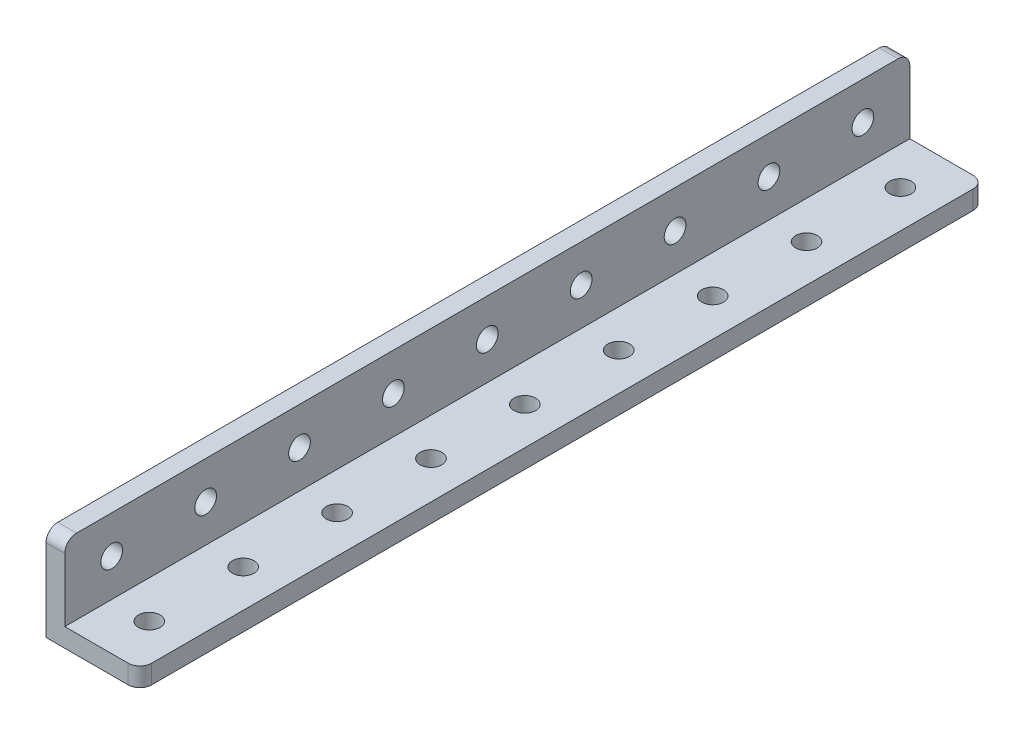
ISO-10303-21;
HEADER;
FILE_DESCRIPTION(('STEP AP214'),'2;1');
FILE_NAME('part.step','',(''),(''),'','','');
FILE_SCHEMA(('AUTOMOTIVE_DESIGN { 1 0 10303 214 1 1 1 1 }'));
ENDSEC;
DATA;
#1=APPLICATION_CONTEXT('core data for automotive mechanical design processes');
#2=APPLICATION_PROTOCOL_DEFINITION('international standard','automotive_design',2000,#1);
#3=PRODUCT_CONTEXT('',#1,'mechanical');
#4=PRODUCT('Part','Part','',(#3));
#5=PRODUCT_RELATED_PRODUCT_CATEGORY('part','',(#4));
#6=PRODUCT_DEFINITION_FORMATION('','',#4);
#7=PRODUCT_DEFINITION_CONTEXT('part definition',#1,'design');
#8=PRODUCT_DEFINITION('design','',#6,#7);
#9=PRODUCT_DEFINITION_SHAPE('','',#8);
#10=(LENGTH_UNIT() NAMED_UNIT(*) SI_UNIT(.MILLI.,.METRE.));
#11=(NAMED_UNIT(*) PLANE_ANGLE_UNIT() SI_UNIT($,.RADIAN.));
#12=(NAMED_UNIT(*) SI_UNIT($,.STERADIAN.) SOLID_ANGLE_UNIT());
#13=UNCERTAINTY_MEASURE_WITH_UNIT(LENGTH_MEASURE(1.E-05),#10,'distance_accuracy_value','');
#14=(GEOMETRIC_REPRESENTATION_CONTEXT(3) GLOBAL_UNCERTAINTY_ASSIGNED_CONTEXT((#13)) GLOBAL_UNIT_ASSIGNED_CONTEXT((#10,
#11,#12)) REPRESENTATION_CONTEXT('',''));
#15=CARTESIAN_POINT('',(0.,0.,0.));
#16=DIRECTION('',(0.,0.,1.));
#17=DIRECTION('',(1.,0.,0.));
#18=AXIS2_PLACEMENT_3D('',#15,#16,#17);
#19=CARTESIAN_POINT('',(0.,16.,0.));
#20=DIRECTION('',(0.,0.,1.));
#21=DIRECTION('',(1.,0.,0.));
#22=AXIS2_PLACEMENT_3D('',#19,#20,#21);
#23=PLANE('',#22);
#24=DIRECTION('',(0.,-1.,0.));
#25=VECTOR('',#24,1.);
#26=CARTESIAN_POINT('',(3.2,16.,0.));
#27=LINE('',#26,#25);
#28=CARTESIAN_POINT('',(3.2,14.,0.));
#29=VERTEX_POINT('',#28);
#30=CARTESIAN_POINT('',(3.2,3.2,0.));
#31=VERTEX_POINT('',#30);
#32=EDGE_CURVE('E127',#29,#31,#27,.T.);
#33=ORIENTED_EDGE('',*,*,#32,.F.);
#34=DIRECTION('',(1.,0.,0.));
#35=VECTOR('',#34,1.);
#36=CARTESIAN_POINT('',(0.,14.,0.));
#37=LINE('',#36,#35);
#38=CARTESIAN_POINT('',(0.,14.,0.));
#39=VERTEX_POINT('',#38);
#40=EDGE_CURVE('E190',#29,#39,#37,.F.);
#41=ORIENTED_EDGE('',*,*,#40,.T.);
#42=DIRECTION('',(0.,-1.,0.));
#43=VECTOR('',#42,1.);
#44=CARTESIAN_POINT('',(0.,16.,0.));
#45=LINE('',#44,#43);
#46=CARTESIAN_POINT('',(0.,0.,0.));
#47=VERTEX_POINT('',#46);
#48=EDGE_CURVE('E148',#39,#47,#45,.T.);
#49=ORIENTED_EDGE('',*,*,#48,.T.);
#50=DIRECTION('',(1.,0.,0.));
#51=VECTOR('',#50,1.);
#52=CARTESIAN_POINT('',(0.,0.,0.));
#53=LINE('',#52,#51);
#54=CARTESIAN_POINT('',(14.,0.,0.));
#55=VERTEX_POINT('',#54);
#56=EDGE_CURVE('E158',#47,#55,#53,.T.);
#57=ORIENTED_EDGE('',*,*,#56,.T.);
#58=DIRECTION('',(0.,-1.,0.));
#59=VECTOR('',#58,1.);
#60=CARTESIAN_POINT('',(14.,16.,0.));
#61=LINE('',#60,#59);
#62=CARTESIAN_POINT('',(14.,3.2,0.));
#63=VERTEX_POINT('',#62);
#64=EDGE_CURVE('E188',#55,#63,#61,.F.);
#65=ORIENTED_EDGE('',*,*,#64,.T.);
#66=DIRECTION('',(1.,0.,0.));
#67=VECTOR('',#66,1.);
#68=CARTESIAN_POINT('',(3.2,3.2,0.));
#69=LINE('',#68,#67);
#70=EDGE_CURVE('E121',#31,#63,#69,.T.);
#71=ORIENTED_EDGE('',*,*,#70,.F.);
#72=EDGE_LOOP('',(#33,#41,#49,#57,#65,#71));
#73=FACE_BOUND('',#72,.T.);
#74=ADVANCED_FACE('F33',(#73),#23,.T.);
#75=CARTESIAN_POINT('',(0.,16.,-144.));
#76=DIRECTION('',(0.,1.,0.));
#77=DIRECTION('',(0.,0.,1.));
#78=AXIS2_PLACEMENT_3D('',#75,#76,#77);
#79=PLANE('',#78);
#80=DIRECTION('',(0.,0.,1.));
#81=VECTOR('',#80,1.);
#82=CARTESIAN_POINT('',(3.2,16.,-144.));
#83=LINE('',#82,#81);
#84=CARTESIAN_POINT('',(3.2,16.,-142.));
#85=VERTEX_POINT('',#84);
#86=CARTESIAN_POINT('',(3.2,16.,-2.));
#87=VERTEX_POINT('',#86);
#88=EDGE_CURVE('E142',#85,#87,#83,.T.);
#89=ORIENTED_EDGE('',*,*,#88,.F.);
#90=DIRECTION('',(1.,0.,0.));
#91=VECTOR('',#90,1.);
#92=CARTESIAN_POINT('',(0.,16.,-142.));
#93=LINE('',#92,#91);
#94=CARTESIAN_POINT('',(0.,16.,-142.));
#95=VERTEX_POINT('',#94);
#96=EDGE_CURVE('E182',#85,#95,#93,.F.);
#97=ORIENTED_EDGE('',*,*,#96,.T.);
#98=DIRECTION('',(0.,0.,1.));
#99=VECTOR('',#98,1.);
#100=CARTESIAN_POINT('',(0.,16.,-144.));
#101=LINE('',#100,#99);
#102=CARTESIAN_POINT('',(0.,16.,-2.));
#103=VERTEX_POINT('',#102);
#104=EDGE_CURVE('E155',#95,#103,#101,.T.);
#105=ORIENTED_EDGE('',*,*,#104,.T.);
#106=DIRECTION('',(1.,0.,0.));
#107=VECTOR('',#106,1.);
#108=CARTESIAN_POINT('',(0.,16.,-2.));
#109=LINE('',#108,#107);
#110=EDGE_CURVE('E179',#103,#87,#109,.T.);
#111=ORIENTED_EDGE('',*,*,#110,.T.);
#112=EDGE_LOOP('',(#89,#97,#105,#111));
#113=FACE_BOUND('',#112,.T.);
#114=ADVANCED_FACE('F221',(#113),#79,.T.);
#115=CARTESIAN_POINT('',(0.,0.,-144.));
#116=DIRECTION('',(0.,0.,-1.));
#117=DIRECTION('',(-1.,0.,0.));
#118=AXIS2_PLACEMENT_3D('',#115,#116,#117);
#119=PLANE('',#118);
#120=DIRECTION('',(0.,1.,0.));
#121=VECTOR('',#120,1.);
#122=CARTESIAN_POINT('',(0.,0.,-144.));
#123=LINE('',#122,#121);
#124=CARTESIAN_POINT('',(0.,0.,-144.));
#125=VERTEX_POINT('',#124);
#126=CARTESIAN_POINT('',(0.,14.,-144.));
#127=VERTEX_POINT('',#126);
#128=EDGE_CURVE('E153',#125,#127,#123,.T.);
#129=ORIENTED_EDGE('',*,*,#128,.T.);
#130=DIRECTION('',(1.,0.,0.));
#131=VECTOR('',#130,1.);
#132=CARTESIAN_POINT('',(0.,14.,-144.));
#133=LINE('',#132,#131);
#134=CARTESIAN_POINT('',(3.2,14.,-144.));
#135=VERTEX_POINT('',#134);
#136=EDGE_CURVE('E119',#127,#135,#133,.T.);
#137=ORIENTED_EDGE('',*,*,#136,.T.);
#138=DIRECTION('',(0.,-1.,0.));
#139=VECTOR('',#138,1.);
#140=CARTESIAN_POINT('',(3.2,16.,-144.));
#141=LINE('',#140,#139);
#142=CARTESIAN_POINT('',(3.2,3.2,-144.));
#143=VERTEX_POINT('',#142);
#144=EDGE_CURVE('E111',#135,#143,#141,.T.);
#145=ORIENTED_EDGE('',*,*,#144,.T.);
#146=DIRECTION('',(1.,0.,0.));
#147=VECTOR('',#146,1.);
#148=CARTESIAN_POINT('',(3.2,3.2,-144.));
#149=LINE('',#148,#147);
#150=CARTESIAN_POINT('',(14.,3.2,-144.));
#151=VERTEX_POINT('',#150);
#152=EDGE_CURVE('E116',#143,#151,#149,.T.);
#153=ORIENTED_EDGE('',*,*,#152,.T.);
#154=DIRECTION('',(0.,1.,0.));
#155=VECTOR('',#154,1.);
#156=CARTESIAN_POINT('',(14.,0.,-144.));
#157=LINE('',#156,#155);
#158=CARTESIAN_POINT('',(14.,0.,-144.));
#159=VERTEX_POINT('',#158);
#160=EDGE_CURVE('E162',#151,#159,#157,.F.);
#161=ORIENTED_EDGE('',*,*,#160,.T.);
#162=DIRECTION('',(1.,0.,0.));
#163=VECTOR('',#162,1.);
#164=CARTESIAN_POINT('',(0.,0.,-144.));
#165=LINE('',#164,#163);
#166=EDGE_CURVE('E160',#125,#159,#165,.T.);
#167=ORIENTED_EDGE('',*,*,#166,.F.);
#168=EDGE_LOOP('',(#129,#137,#145,#153,#161,#167));
#169=FACE_BOUND('',#168,.T.);
#170=ADVANCED_FACE('F114',(#169),#119,.T.);
#171=CARTESIAN_POINT('',(0.,0.,0.));
#172=DIRECTION('',(0.,-1.,0.));
#173=DIRECTION('',(0.,0.,-1.));
#174=AXIS2_PLACEMENT_3D('',#171,#172,#173);
#175=PLANE('',#174);
#176=CARTESIAN_POINT('',(9.6,0.,-24.));
#177=DIRECTION('',(0.,-1.,0.));
#178=DIRECTION('',(0.,0.,-1.));
#179=AXIS2_PLACEMENT_3D('',#176,#177,#178);
#180=CIRCLE('',#179,1.84999999999999);
#181=CARTESIAN_POINT('',(9.6,0.,-25.85));
#182=VERTEX_POINT('',#181);
#183=EDGE_CURVE('E332',#182,#182,#180,.T.);
#184=ORIENTED_EDGE('',*,*,#183,.F.);
#185=EDGE_LOOP('',(#184));
#186=FACE_BOUND('',#185,.T.);
#187=CARTESIAN_POINT('',(9.6,0.,-40.));
#188=DIRECTION('',(0.,-1.,0.));
#189=DIRECTION('',(0.,0.,-1.));
#190=AXIS2_PLACEMENT_3D('',#187,#188,#189);
#191=CIRCLE('',#190,1.84999999999999);
#192=CARTESIAN_POINT('',(9.6,0.,-41.85));
#193=VERTEX_POINT('',#192);
#194=EDGE_CURVE('E336',#193,#193,#191,.T.);
#195=ORIENTED_EDGE('',*,*,#194,.F.);
#196=EDGE_LOOP('',(#195));
#197=FACE_BOUND('',#196,.T.);
#198=CARTESIAN_POINT('',(9.6,0.,-56.));
#199=DIRECTION('',(0.,-1.,0.));
#200=DIRECTION('',(0.,0.,-1.));
#201=AXIS2_PLACEMENT_3D('',#198,#199,#200);
#202=CIRCLE('',#201,1.84999999999999);
#203=CARTESIAN_POINT('',(9.6,0.,-57.85));
#204=VERTEX_POINT('',#203);
#205=EDGE_CURVE('E345',#204,#204,#202,.T.);
#206=ORIENTED_EDGE('',*,*,#205,.F.);
#207=EDGE_LOOP('',(#206));
#208=FACE_BOUND('',#207,.T.);
#209=CARTESIAN_POINT('',(9.6,0.,-72.));
#210=DIRECTION('',(0.,-1.,0.));
#211=DIRECTION('',(0.,0.,-1.));
#212=AXIS2_PLACEMENT_3D('',#209,#210,#211);
#213=CIRCLE('',#212,1.84999999999999);
#214=CARTESIAN_POINT('',(9.6,0.,-73.85));
#215=VERTEX_POINT('',#214);
#216=EDGE_CURVE('E351',#215,#215,#213,.T.);
#217=ORIENTED_EDGE('',*,*,#216,.F.);
#218=EDGE_LOOP('',(#217));
#219=FACE_BOUND('',#218,.T.);
#220=CARTESIAN_POINT('',(9.6,0.,-88.));
#221=DIRECTION('',(0.,-1.,0.));
#222=DIRECTION('',(0.,0.,-1.));
#223=AXIS2_PLACEMENT_3D('',#220,#221,#222);
#224=CIRCLE('',#223,1.84999999999999);
#225=CARTESIAN_POINT('',(9.6,0.,-89.85));
#226=VERTEX_POINT('',#225);
#227=EDGE_CURVE('E357',#226,#226,#224,.T.);
#228=ORIENTED_EDGE('',*,*,#227,.F.);
#229=EDGE_LOOP('',(#228));
#230=FACE_BOUND('',#229,.T.);
#231=CARTESIAN_POINT('',(9.6,0.,-104.));
#232=DIRECTION('',(0.,-1.,0.));
#233=DIRECTION('',(0.,0.,-1.));
#234=AXIS2_PLACEMENT_3D('',#231,#232,#233);
#235=CIRCLE('',#234,1.84999999999999);
#236=CARTESIAN_POINT('',(9.6,0.,-105.85));
#237=VERTEX_POINT('',#236);
#238=EDGE_CURVE('E363',#237,#237,#235,.T.);
#239=ORIENTED_EDGE('',*,*,#238,.F.);
#240=EDGE_LOOP('',(#239));
#241=FACE_BOUND('',#240,.T.);
#242=CARTESIAN_POINT('',(9.6,0.,-120.));
#243=DIRECTION('',(0.,-1.,0.));
#244=DIRECTION('',(0.,0.,-1.));
#245=AXIS2_PLACEMENT_3D('',#242,#243,#244);
#246=CIRCLE('',#245,1.84999999999999);
#247=CARTESIAN_POINT('',(9.6,0.,-121.85));
#248=VERTEX_POINT('',#247);
#249=EDGE_CURVE('E369',#248,#248,#246,.T.);
#250=ORIENTED_EDGE('',*,*,#249,.F.);
#251=EDGE_LOOP('',(#250));
#252=FACE_BOUND('',#251,.T.);
#253=CARTESIAN_POINT('',(9.6,0.,-136.));
#254=DIRECTION('',(0.,-1.,0.));
#255=DIRECTION('',(0.,0.,-1.));
#256=AXIS2_PLACEMENT_3D('',#253,#254,#255);
#257=CIRCLE('',#256,1.84999999999999);
#258=CARTESIAN_POINT('',(9.6,0.,-137.85));
#259=VERTEX_POINT('',#258);
#260=EDGE_CURVE('E375',#259,#259,#257,.T.);
#261=ORIENTED_EDGE('',*,*,#260,.F.);
#262=EDGE_LOOP('',(#261));
#263=FACE_BOUND('',#262,.T.);
#264=CARTESIAN_POINT('',(9.6,0.,-8.));
#265=DIRECTION('',(0.,-1.,0.));
#266=DIRECTION('',(0.,0.,-1.));
#267=AXIS2_PLACEMENT_3D('',#264,#265,#266);
#268=CIRCLE('',#267,1.84999999999999);
#269=CARTESIAN_POINT('',(9.6,0.,-9.84999999999999));
#270=VERTEX_POINT('',#269);
#271=EDGE_CURVE('E381',#270,#270,#268,.T.);
#272=ORIENTED_EDGE('',*,*,#271,.F.);
#273=EDGE_LOOP('',(#272));
#274=FACE_BOUND('',#273,.T.);
#275=ORIENTED_EDGE('',*,*,#166,.T.);
#276=CARTESIAN_POINT('',(14.,0.,-142.));
#277=DIRECTION('',(0.,-1.,0.));
#278=DIRECTION('',(0.,0.,-1.));
#279=AXIS2_PLACEMENT_3D('',#276,#277,#278);
#280=CIRCLE('',#279,2.);
#281=CARTESIAN_POINT('',(16.,0.,-142.));
#282=VERTEX_POINT('',#281);
#283=EDGE_CURVE('E11',#159,#282,#280,.T.);
#284=ORIENTED_EDGE('',*,*,#283,.T.);
#285=DIRECTION('',(0.,0.,-1.));
#286=VECTOR('',#285,1.);
#287=CARTESIAN_POINT('',(16.,0.,0.));
#288=LINE('',#287,#286);
#289=CARTESIAN_POINT('',(16.,0.,-2.));
#290=VERTEX_POINT('',#289);
#291=EDGE_CURVE('E145',#290,#282,#288,.T.);
#292=ORIENTED_EDGE('',*,*,#291,.F.);
#293=CARTESIAN_POINT('',(14.,0.,-2.));
#294=DIRECTION('',(0.,-1.,0.));
#295=DIRECTION('',(0.,0.,-1.));
#296=AXIS2_PLACEMENT_3D('',#293,#294,#295);
#297=CIRCLE('',#296,2.);
#298=EDGE_CURVE('E41',#290,#55,#297,.T.);
#299=ORIENTED_EDGE('',*,*,#298,.T.);
#300=ORIENTED_EDGE('',*,*,#56,.F.);
#301=DIRECTION('',(0.,0.,-1.));
#302=VECTOR('',#301,1.);
#303=CARTESIAN_POINT('',(0.,0.,0.));
#304=LINE('',#303,#302);
#305=EDGE_CURVE('E150',#47,#125,#304,.T.);
#306=ORIENTED_EDGE('',*,*,#305,.T.);
#307=EDGE_LOOP('',(#275,#284,#292,#299,#300,#306));
#308=FACE_BOUND('',#307,.T.);
#309=ADVANCED_FACE('F200',(#186,#197,#208,#219,#230,#241,#252,#263,#274,#308),#175,.T.);
#310=CARTESIAN_POINT('',(0.,0.,0.));
#311=DIRECTION('',(1.,0.,0.));
#312=DIRECTION('',(0.,0.,-1.));
#313=AXIS2_PLACEMENT_3D('',#310,#311,#312);
#314=PLANE('',#313);
#315=CARTESIAN_POINT('',(0.,9.6,-24.));
#316=DIRECTION('',(-1.,0.,0.));
#317=DIRECTION('',(0.,0.,1.));
#318=AXIS2_PLACEMENT_3D('',#315,#316,#317);
#319=CIRCLE('',#318,1.84999999999999);
#320=CARTESIAN_POINT('',(0.,9.6,-22.15));
#321=VERTEX_POINT('',#320);
#322=EDGE_CURVE('E387',#321,#321,#319,.T.);
#323=ORIENTED_EDGE('',*,*,#322,.F.);
#324=EDGE_LOOP('',(#323));
#325=FACE_BOUND('',#324,.T.);
#326=CARTESIAN_POINT('',(0.,9.6,-40.));
#327=DIRECTION('',(-1.,0.,0.));
#328=DIRECTION('',(0.,0.,1.));
#329=AXIS2_PLACEMENT_3D('',#326,#327,#328);
#330=CIRCLE('',#329,1.84999999999999);
#331=CARTESIAN_POINT('',(0.,9.6,-38.15));
#332=VERTEX_POINT('',#331);
#333=EDGE_CURVE('E393',#332,#332,#330,.T.);
#334=ORIENTED_EDGE('',*,*,#333,.F.);
#335=EDGE_LOOP('',(#334));
#336=FACE_BOUND('',#335,.T.);
#337=CARTESIAN_POINT('',(0.,9.6,-56.));
#338=DIRECTION('',(-1.,0.,0.));
#339=DIRECTION('',(0.,0.,1.));
#340=AXIS2_PLACEMENT_3D('',#337,#338,#339);
#341=CIRCLE('',#340,1.84999999999999);
#342=CARTESIAN_POINT('',(0.,9.6,-54.15));
#343=VERTEX_POINT('',#342);
#344=EDGE_CURVE('E399',#343,#343,#341,.T.);
#345=ORIENTED_EDGE('',*,*,#344,.F.);
#346=EDGE_LOOP('',(#345));
#347=FACE_BOUND('',#346,.T.);
#348=CARTESIAN_POINT('',(0.,9.6,-72.));
#349=DIRECTION('',(-1.,0.,0.));
#350=DIRECTION('',(0.,0.,1.));
#351=AXIS2_PLACEMENT_3D('',#348,#349,#350);
#352=CIRCLE('',#351,1.84999999999999);
#353=CARTESIAN_POINT('',(0.,9.6,-70.15));
#354=VERTEX_POINT('',#353);
#355=EDGE_CURVE('E172',#354,#354,#352,.T.);
#356=ORIENTED_EDGE('',*,*,#355,.F.);
#357=EDGE_LOOP('',(#356));
#358=FACE_BOUND('',#357,.T.);
#359=CARTESIAN_POINT('',(0.,9.6,-88.));
#360=DIRECTION('',(-1.,0.,0.));
#361=DIRECTION('',(0.,0.,1.));
#362=AXIS2_PLACEMENT_3D('',#359,#360,#361);
#363=CIRCLE('',#362,1.84999999999999);
#364=CARTESIAN_POINT('',(0.,9.6,-86.15));
#365=VERTEX_POINT('',#364);
#366=EDGE_CURVE('E171',#365,#365,#363,.T.);
#367=ORIENTED_EDGE('',*,*,#366,.F.);
#368=EDGE_LOOP('',(#367));
#369=FACE_BOUND('',#368,.T.);
#370=CARTESIAN_POINT('',(0.,9.6,-104.));
#371=DIRECTION('',(-1.,0.,0.));
#372=DIRECTION('',(0.,0.,1.));
#373=AXIS2_PLACEMENT_3D('',#370,#371,#372);
#374=CIRCLE('',#373,1.84999999999999);
#375=CARTESIAN_POINT('',(0.,9.6,-102.15));
#376=VERTEX_POINT('',#375);
#377=EDGE_CURVE('E412',#376,#376,#374,.T.);
#378=ORIENTED_EDGE('',*,*,#377,.F.);
#379=EDGE_LOOP('',(#378));
#380=FACE_BOUND('',#379,.T.);
#381=CARTESIAN_POINT('',(0.,9.6,-120.));
#382=DIRECTION('',(-1.,0.,0.));
#383=DIRECTION('',(0.,0.,1.));
#384=AXIS2_PLACEMENT_3D('',#381,#382,#383);
#385=CIRCLE('',#384,1.84999999999999);
#386=CARTESIAN_POINT('',(0.,9.6,-118.15));
#387=VERTEX_POINT('',#386);
#388=EDGE_CURVE('E418',#387,#387,#385,.T.);
#389=ORIENTED_EDGE('',*,*,#388,.F.);
#390=EDGE_LOOP('',(#389));
#391=FACE_BOUND('',#390,.T.);
#392=CARTESIAN_POINT('',(0.,9.6,-136.));
#393=DIRECTION('',(-1.,0.,0.));
#394=DIRECTION('',(0.,0.,1.));
#395=AXIS2_PLACEMENT_3D('',#392,#393,#394);
#396=CIRCLE('',#395,1.84999999999999);
#397=CARTESIAN_POINT('',(0.,9.6,-134.15));
#398=VERTEX_POINT('',#397);
#399=EDGE_CURVE('E424',#398,#398,#396,.T.);
#400=ORIENTED_EDGE('',*,*,#399,.F.);
#401=EDGE_LOOP('',(#400));
#402=FACE_BOUND('',#401,.T.);
#403=CARTESIAN_POINT('',(0.,9.6,-8.));
#404=DIRECTION('',(-1.,0.,0.));
#405=DIRECTION('',(0.,0.,1.));
#406=AXIS2_PLACEMENT_3D('',#403,#404,#405);
#407=CIRCLE('',#406,1.84999999999999);
#408=CARTESIAN_POINT('',(0.,9.6,-6.15000000000001));
#409=VERTEX_POINT('',#408);
#410=EDGE_CURVE('E167',#409,#409,#407,.T.);
#411=ORIENTED_EDGE('',*,*,#410,.F.);
#412=EDGE_LOOP('',(#411));
#413=FACE_BOUND('',#412,.T.);
#414=ORIENTED_EDGE('',*,*,#104,.F.);
#415=CARTESIAN_POINT('',(0.,14.,-142.));
#416=DIRECTION('',(1.,0.,0.));
#417=DIRECTION('',(0.,0.,-1.));
#418=AXIS2_PLACEMENT_3D('',#415,#416,#417);
#419=CIRCLE('',#418,2.);
#420=EDGE_CURVE('E186',#95,#127,#419,.F.);
#421=ORIENTED_EDGE('',*,*,#420,.T.);
#422=ORIENTED_EDGE('',*,*,#128,.F.);
#423=ORIENTED_EDGE('',*,*,#305,.F.);
#424=ORIENTED_EDGE('',*,*,#48,.F.);
#425=CARTESIAN_POINT('',(0.,14.,-2.));
#426=DIRECTION('',(1.,0.,0.));
#427=DIRECTION('',(0.,0.,-1.));
#428=AXIS2_PLACEMENT_3D('',#425,#426,#427);
#429=CIRCLE('',#428,2.);
#430=EDGE_CURVE('E184',#39,#103,#429,.F.);
#431=ORIENTED_EDGE('',*,*,#430,.T.);
#432=EDGE_LOOP('',(#414,#421,#422,#423,#424,#431));
#433=FACE_BOUND('',#432,.T.);
#434=ADVANCED_FACE('F213',(#325,#336,#347,#358,#369,#380,#391,#402,#413,#433),#314,.F.);
#435=CARTESIAN_POINT('',(16.,0.,0.));
#436=DIRECTION('',(1.,0.,0.));
#437=DIRECTION('',(0.,0.,-1.));
#438=AXIS2_PLACEMENT_3D('',#435,#436,#437);
#439=PLANE('',#438);
#440=ORIENTED_EDGE('',*,*,#291,.T.);
#441=DIRECTION('',(0.,1.,0.));
#442=VECTOR('',#441,1.);
#443=CARTESIAN_POINT('',(16.,0.,-142.));
#444=LINE('',#443,#442);
#445=CARTESIAN_POINT('',(16.,3.2,-142.));
#446=VERTEX_POINT('',#445);
#447=EDGE_CURVE('E194',#282,#446,#444,.T.);
#448=ORIENTED_EDGE('',*,*,#447,.T.);
#449=DIRECTION('',(0.,0.,1.));
#450=VECTOR('',#449,1.);
#451=CARTESIAN_POINT('',(16.,3.2,-144.));
#452=LINE('',#451,#450);
#453=CARTESIAN_POINT('',(16.,3.2,-2.));
#454=VERTEX_POINT('',#453);
#455=EDGE_CURVE('E131',#446,#454,#452,.T.);
#456=ORIENTED_EDGE('',*,*,#455,.T.);
#457=DIRECTION('',(0.,-1.,0.));
#458=VECTOR('',#457,1.);
#459=CARTESIAN_POINT('',(16.,0.,-2.));
#460=LINE('',#459,#458);
#461=EDGE_CURVE('E192',#454,#290,#460,.T.);
#462=ORIENTED_EDGE('',*,*,#461,.T.);
#463=EDGE_LOOP('',(#440,#448,#456,#462));
#464=FACE_BOUND('',#463,.T.);
#465=ADVANCED_FACE('F206',(#464),#439,.T.);
#466=CARTESIAN_POINT('',(3.2,16.,-144.));
#467=DIRECTION('',(-1.,0.,0.));
#468=DIRECTION('',(0.,-1.,0.));
#469=AXIS2_PLACEMENT_3D('',#466,#467,#468);
#470=PLANE('',#469);
#471=CARTESIAN_POINT('',(3.2,9.6,-24.));
#472=DIRECTION('',(-1.,0.,0.));
#473=DIRECTION('',(0.,-1.,0.));
#474=AXIS2_PLACEMENT_3D('',#471,#472,#473);
#475=CIRCLE('',#474,1.84999999999999);
#476=CARTESIAN_POINT('',(3.2,7.75000000000001,-24.));
#477=VERTEX_POINT('',#476);
#478=EDGE_CURVE('E390',#477,#477,#475,.T.);
#479=ORIENTED_EDGE('',*,*,#478,.T.);
#480=EDGE_LOOP('',(#479));
#481=FACE_BOUND('',#480,.T.);
#482=CARTESIAN_POINT('',(3.2,9.6,-40.));
#483=DIRECTION('',(-1.,0.,0.));
#484=DIRECTION('',(0.,-1.,0.));
#485=AXIS2_PLACEMENT_3D('',#482,#483,#484);
#486=CIRCLE('',#485,1.84999999999999);
#487=CARTESIAN_POINT('',(3.2,7.75000000000001,-40.));
#488=VERTEX_POINT('',#487);
#489=EDGE_CURVE('E396',#488,#488,#486,.T.);
#490=ORIENTED_EDGE('',*,*,#489,.T.);
#491=EDGE_LOOP('',(#490));
#492=FACE_BOUND('',#491,.T.);
#493=CARTESIAN_POINT('',(3.2,9.6,-56.));
#494=DIRECTION('',(-1.,0.,0.));
#495=DIRECTION('',(0.,-1.,0.));
#496=AXIS2_PLACEMENT_3D('',#493,#494,#495);
#497=CIRCLE('',#496,1.84999999999999);
#498=CARTESIAN_POINT('',(3.2,7.75000000000001,-56.));
#499=VERTEX_POINT('',#498);
#500=EDGE_CURVE('E402',#499,#499,#497,.T.);
#501=ORIENTED_EDGE('',*,*,#500,.T.);
#502=EDGE_LOOP('',(#501));
#503=FACE_BOUND('',#502,.T.);
#504=CARTESIAN_POINT('',(3.2,9.6,-72.));
#505=DIRECTION('',(-1.,0.,0.));
#506=DIRECTION('',(0.,-1.,0.));
#507=AXIS2_PLACEMENT_3D('',#504,#505,#506);
#508=CIRCLE('',#507,1.84999999999999);
#509=CARTESIAN_POINT('',(3.2,7.75000000000001,-72.));
#510=VERTEX_POINT('',#509);
#511=EDGE_CURVE('E168',#510,#510,#508,.T.);
#512=ORIENTED_EDGE('',*,*,#511,.T.);
#513=EDGE_LOOP('',(#512));
#514=FACE_BOUND('',#513,.T.);
#515=CARTESIAN_POINT('',(3.2,9.6,-88.));
#516=DIRECTION('',(-1.,0.,0.));
#517=DIRECTION('',(0.,-1.,0.));
#518=AXIS2_PLACEMENT_3D('',#515,#516,#517);
#519=CIRCLE('',#518,1.84999999999999);
#520=CARTESIAN_POINT('',(3.2,7.75000000000001,-88.));
#521=VERTEX_POINT('',#520);
#522=EDGE_CURVE('E409',#521,#521,#519,.T.);
#523=ORIENTED_EDGE('',*,*,#522,.T.);
#524=EDGE_LOOP('',(#523));
#525=FACE_BOUND('',#524,.T.);
#526=CARTESIAN_POINT('',(3.2,9.6,-104.));
#527=DIRECTION('',(-1.,0.,0.));
#528=DIRECTION('',(0.,-1.,0.));
#529=AXIS2_PLACEMENT_3D('',#526,#527,#528);
#530=CIRCLE('',#529,1.84999999999999);
#531=CARTESIAN_POINT('',(3.2,7.75000000000001,-104.));
#532=VERTEX_POINT('',#531);
#533=EDGE_CURVE('E415',#532,#532,#530,.T.);
#534=ORIENTED_EDGE('',*,*,#533,.T.);
#535=EDGE_LOOP('',(#534));
#536=FACE_BOUND('',#535,.T.);
#537=CARTESIAN_POINT('',(3.2,9.6,-120.));
#538=DIRECTION('',(-1.,0.,0.));
#539=DIRECTION('',(0.,-1.,0.));
#540=AXIS2_PLACEMENT_3D('',#537,#538,#539);
#541=CIRCLE('',#540,1.84999999999999);
#542=CARTESIAN_POINT('',(3.2,7.75000000000001,-120.));
#543=VERTEX_POINT('',#542);
#544=EDGE_CURVE('E421',#543,#543,#541,.T.);
#545=ORIENTED_EDGE('',*,*,#544,.T.);
#546=EDGE_LOOP('',(#545));
#547=FACE_BOUND('',#546,.T.);
#548=CARTESIAN_POINT('',(3.2,9.6,-136.));
#549=DIRECTION('',(-1.,0.,0.));
#550=DIRECTION('',(0.,-1.,0.));
#551=AXIS2_PLACEMENT_3D('',#548,#549,#550);
#552=CIRCLE('',#551,1.84999999999999);
#553=CARTESIAN_POINT('',(3.2,7.75000000000001,-136.));
#554=VERTEX_POINT('',#553);
#555=EDGE_CURVE('E427',#554,#554,#552,.T.);
#556=ORIENTED_EDGE('',*,*,#555,.T.);
#557=EDGE_LOOP('',(#556));
#558=FACE_BOUND('',#557,.T.);
#559=CARTESIAN_POINT('',(3.2,9.6,-8.));
#560=DIRECTION('',(-1.,0.,0.));
#561=DIRECTION('',(0.,-1.,0.));
#562=AXIS2_PLACEMENT_3D('',#559,#560,#561);
#563=CIRCLE('',#562,1.84999999999999);
#564=CARTESIAN_POINT('',(3.2,7.75000000000001,-8.));
#565=VERTEX_POINT('',#564);
#566=EDGE_CURVE('E140',#565,#565,#563,.T.);
#567=ORIENTED_EDGE('',*,*,#566,.T.);
#568=EDGE_LOOP('',(#567));
#569=FACE_BOUND('',#568,.T.);
#570=ORIENTED_EDGE('',*,*,#144,.F.);
#571=CARTESIAN_POINT('',(3.2,14.,-142.));
#572=DIRECTION('',(-1.,0.,0.));
#573=DIRECTION('',(0.,-1.,0.));
#574=AXIS2_PLACEMENT_3D('',#571,#572,#573);
#575=CIRCLE('',#574,2.);
#576=EDGE_CURVE('E177',#135,#85,#575,.F.);
#577=ORIENTED_EDGE('',*,*,#576,.T.);
#578=ORIENTED_EDGE('',*,*,#88,.T.);
#579=CARTESIAN_POINT('',(3.2,14.,-2.));
#580=DIRECTION('',(-1.,0.,0.));
#581=DIRECTION('',(0.,-1.,0.));
#582=AXIS2_PLACEMENT_3D('',#579,#580,#581);
#583=CIRCLE('',#582,2.);
#584=EDGE_CURVE('E175',#87,#29,#583,.F.);
#585=ORIENTED_EDGE('',*,*,#584,.T.);
#586=ORIENTED_EDGE('',*,*,#32,.T.);
#587=DIRECTION('',(0.,0.,1.));
#588=VECTOR('',#587,1.);
#589=CARTESIAN_POINT('',(3.2,3.2,-144.));
#590=LINE('',#589,#588);
#591=EDGE_CURVE('E124',#143,#31,#590,.T.);
#592=ORIENTED_EDGE('',*,*,#591,.F.);
#593=EDGE_LOOP('',(#570,#577,#578,#585,#586,#592));
#594=FACE_BOUND('',#593,.T.);
#595=ADVANCED_FACE('F125',(#481,#492,#503,#514,#525,#536,#547,#558,#569,#594),#470,.F.);
#596=CARTESIAN_POINT('',(3.2,3.2,-144.));
#597=DIRECTION('',(0.,-1.,0.));
#598=DIRECTION('',(0.,0.,-1.));
#599=AXIS2_PLACEMENT_3D('',#596,#597,#598);
#600=PLANE('',#599);
#601=CARTESIAN_POINT('',(9.6,3.2,-24.));
#602=DIRECTION('',(0.,-1.,0.));
#603=DIRECTION('',(0.,0.,-1.));
#604=AXIS2_PLACEMENT_3D('',#601,#602,#603);
#605=CIRCLE('',#604,1.84999999999999);
#606=CARTESIAN_POINT('',(9.6,3.2,-25.85));
#607=VERTEX_POINT('',#606);
#608=EDGE_CURVE('E335',#607,#607,#605,.T.);
#609=ORIENTED_EDGE('',*,*,#608,.T.);
#610=EDGE_LOOP('',(#609));
#611=FACE_BOUND('',#610,.T.);
#612=CARTESIAN_POINT('',(9.6,3.2,-40.));
#613=DIRECTION('',(0.,-1.,0.));
#614=DIRECTION('',(0.,0.,-1.));
#615=AXIS2_PLACEMENT_3D('',#612,#613,#614);
#616=CIRCLE('',#615,1.84999999999999);
#617=CARTESIAN_POINT('',(9.6,3.2,-41.85));
#618=VERTEX_POINT('',#617);
#619=EDGE_CURVE('E339',#618,#618,#616,.T.);
#620=ORIENTED_EDGE('',*,*,#619,.T.);
#621=EDGE_LOOP('',(#620));
#622=FACE_BOUND('',#621,.T.);
#623=CARTESIAN_POINT('',(9.6,3.2,-56.));
#624=DIRECTION('',(0.,-1.,0.));
#625=DIRECTION('',(0.,0.,-1.));
#626=AXIS2_PLACEMENT_3D('',#623,#624,#625);
#627=CIRCLE('',#626,1.84999999999999);
#628=CARTESIAN_POINT('',(9.6,3.2,-57.85));
#629=VERTEX_POINT('',#628);
#630=EDGE_CURVE('E348',#629,#629,#627,.T.);
#631=ORIENTED_EDGE('',*,*,#630,.T.);
#632=EDGE_LOOP('',(#631));
#633=FACE_BOUND('',#632,.T.);
#634=CARTESIAN_POINT('',(9.6,3.2,-72.));
#635=DIRECTION('',(0.,-1.,0.));
#636=DIRECTION('',(0.,0.,-1.));
#637=AXIS2_PLACEMENT_3D('',#634,#635,#636);
#638=CIRCLE('',#637,1.84999999999999);
#639=CARTESIAN_POINT('',(9.6,3.2,-73.85));
#640=VERTEX_POINT('',#639);
#641=EDGE_CURVE('E354',#640,#640,#638,.T.);
#642=ORIENTED_EDGE('',*,*,#641,.T.);
#643=EDGE_LOOP('',(#642));
#644=FACE_BOUND('',#643,.T.);
#645=CARTESIAN_POINT('',(9.6,3.2,-88.));
#646=DIRECTION('',(0.,-1.,0.));
#647=DIRECTION('',(0.,0.,-1.));
#648=AXIS2_PLACEMENT_3D('',#645,#646,#647);
#649=CIRCLE('',#648,1.84999999999999);
#650=CARTESIAN_POINT('',(9.6,3.2,-89.85));
#651=VERTEX_POINT('',#650);
#652=EDGE_CURVE('E360',#651,#651,#649,.T.);
#653=ORIENTED_EDGE('',*,*,#652,.T.);
#654=EDGE_LOOP('',(#653));
#655=FACE_BOUND('',#654,.T.);
#656=CARTESIAN_POINT('',(9.6,3.2,-104.));
#657=DIRECTION('',(0.,-1.,0.));
#658=DIRECTION('',(0.,0.,-1.));
#659=AXIS2_PLACEMENT_3D('',#656,#657,#658);
#660=CIRCLE('',#659,1.84999999999999);
#661=CARTESIAN_POINT('',(9.6,3.2,-105.85));
#662=VERTEX_POINT('',#661);
#663=EDGE_CURVE('E366',#662,#662,#660,.T.);
#664=ORIENTED_EDGE('',*,*,#663,.T.);
#665=EDGE_LOOP('',(#664));
#666=FACE_BOUND('',#665,.T.);
#667=CARTESIAN_POINT('',(9.6,3.2,-120.));
#668=DIRECTION('',(0.,-1.,0.));
#669=DIRECTION('',(0.,0.,-1.));
#670=AXIS2_PLACEMENT_3D('',#667,#668,#669);
#671=CIRCLE('',#670,1.84999999999999);
#672=CARTESIAN_POINT('',(9.6,3.2,-121.85));
#673=VERTEX_POINT('',#672);
#674=EDGE_CURVE('E372',#673,#673,#671,.T.);
#675=ORIENTED_EDGE('',*,*,#674,.T.);
#676=EDGE_LOOP('',(#675));
#677=FACE_BOUND('',#676,.T.);
#678=CARTESIAN_POINT('',(9.6,3.2,-136.));
#679=DIRECTION('',(0.,-1.,0.));
#680=DIRECTION('',(0.,0.,-1.));
#681=AXIS2_PLACEMENT_3D('',#678,#679,#680);
#682=CIRCLE('',#681,1.84999999999999);
#683=CARTESIAN_POINT('',(9.6,3.2,-137.85));
#684=VERTEX_POINT('',#683);
#685=EDGE_CURVE('E378',#684,#684,#682,.T.);
#686=ORIENTED_EDGE('',*,*,#685,.T.);
#687=EDGE_LOOP('',(#686));
#688=FACE_BOUND('',#687,.T.);
#689=CARTESIAN_POINT('',(9.6,3.2,-8.));
#690=DIRECTION('',(0.,-1.,0.));
#691=DIRECTION('',(0.,0.,-1.));
#692=AXIS2_PLACEMENT_3D('',#689,#690,#691);
#693=CIRCLE('',#692,1.84999999999999);
#694=CARTESIAN_POINT('',(9.6,3.2,-9.84999999999999));
#695=VERTEX_POINT('',#694);
#696=EDGE_CURVE('E384',#695,#695,#693,.T.);
#697=ORIENTED_EDGE('',*,*,#696,.T.);
#698=EDGE_LOOP('',(#697));
#699=FACE_BOUND('',#698,.T.);
#700=ORIENTED_EDGE('',*,*,#455,.F.);
#701=CARTESIAN_POINT('',(14.,3.2,-142.));
#702=DIRECTION('',(0.,-1.,0.));
#703=DIRECTION('',(0.,0.,-1.));
#704=AXIS2_PLACEMENT_3D('',#701,#702,#703);
#705=CIRCLE('',#704,2.);
#706=EDGE_CURVE('E135',#446,#151,#705,.F.);
#707=ORIENTED_EDGE('',*,*,#706,.T.);
#708=ORIENTED_EDGE('',*,*,#152,.F.);
#709=ORIENTED_EDGE('',*,*,#591,.T.);
#710=ORIENTED_EDGE('',*,*,#70,.T.);
#711=CARTESIAN_POINT('',(14.,3.2,-2.));
#712=DIRECTION('',(0.,-1.,0.));
#713=DIRECTION('',(0.,0.,-1.));
#714=AXIS2_PLACEMENT_3D('',#711,#712,#713);
#715=CIRCLE('',#714,2.);
#716=EDGE_CURVE('E197',#63,#454,#715,.F.);
#717=ORIENTED_EDGE('',*,*,#716,.T.);
#718=EDGE_LOOP('',(#700,#707,#708,#709,#710,#717));
#719=FACE_BOUND('',#718,.T.);
#720=ADVANCED_FACE('F134',(#611,#622,#633,#644,#655,#666,#677,#688,#699,#719),#600,.F.);
#721=CARTESIAN_POINT('',(0.,9.6,-8.));
#722=DIRECTION('',(-1.,0.,0.));
#723=DIRECTION('',(0.,0.,1.));
#724=AXIS2_PLACEMENT_3D('',#721,#722,#723);
#725=CYLINDRICAL_SURFACE('',#724,1.84999999999999);
#726=ORIENTED_EDGE('',*,*,#410,.T.);
#727=EDGE_LOOP('',(#726));
#728=FACE_BOUND('',#727,.T.);
#729=ORIENTED_EDGE('',*,*,#566,.F.);
#730=EDGE_LOOP('',(#729));
#731=FACE_BOUND('',#730,.T.);
#732=ADVANCED_FACE('F256',(#728,#731),#725,.F.);
#733=CARTESIAN_POINT('',(0.,9.6,-136.));
#734=DIRECTION('',(-1.,0.,0.));
#735=DIRECTION('',(0.,0.,1.));
#736=AXIS2_PLACEMENT_3D('',#733,#734,#735);
#737=CYLINDRICAL_SURFACE('',#736,1.84999999999999);
#738=ORIENTED_EDGE('',*,*,#399,.T.);
#739=EDGE_LOOP('',(#738));
#740=FACE_BOUND('',#739,.T.);
#741=ORIENTED_EDGE('',*,*,#555,.F.);
#742=EDGE_LOOP('',(#741));
#743=FACE_BOUND('',#742,.T.);
#744=ADVANCED_FACE('F260',(#740,#743),#737,.F.);
#745=CARTESIAN_POINT('',(0.,9.6,-120.));
#746=DIRECTION('',(-1.,0.,0.));
#747=DIRECTION('',(0.,0.,1.));
#748=AXIS2_PLACEMENT_3D('',#745,#746,#747);
#749=CYLINDRICAL_SURFACE('',#748,1.84999999999999);
#750=ORIENTED_EDGE('',*,*,#388,.T.);
#751=EDGE_LOOP('',(#750));
#752=FACE_BOUND('',#751,.T.);
#753=ORIENTED_EDGE('',*,*,#544,.F.);
#754=EDGE_LOOP('',(#753));
#755=FACE_BOUND('',#754,.T.);
#756=ADVANCED_FACE('F264',(#752,#755),#749,.F.);
#757=CARTESIAN_POINT('',(0.,9.6,-104.));
#758=DIRECTION('',(-1.,0.,0.));
#759=DIRECTION('',(0.,0.,1.));
#760=AXIS2_PLACEMENT_3D('',#757,#758,#759);
#761=CYLINDRICAL_SURFACE('',#760,1.84999999999999);
#762=ORIENTED_EDGE('',*,*,#377,.T.);
#763=EDGE_LOOP('',(#762));
#764=FACE_BOUND('',#763,.T.);
#765=ORIENTED_EDGE('',*,*,#533,.F.);
#766=EDGE_LOOP('',(#765));
#767=FACE_BOUND('',#766,.T.);
#768=ADVANCED_FACE('F268',(#764,#767),#761,.F.);
#769=CARTESIAN_POINT('',(0.,9.6,-88.));
#770=DIRECTION('',(-1.,0.,0.));
#771=DIRECTION('',(0.,0.,1.));
#772=AXIS2_PLACEMENT_3D('',#769,#770,#771);
#773=CYLINDRICAL_SURFACE('',#772,1.84999999999999);
#774=ORIENTED_EDGE('',*,*,#366,.T.);
#775=EDGE_LOOP('',(#774));
#776=FACE_BOUND('',#775,.T.);
#777=ORIENTED_EDGE('',*,*,#522,.F.);
#778=EDGE_LOOP('',(#777));
#779=FACE_BOUND('',#778,.T.);
#780=ADVANCED_FACE('F272',(#776,#779),#773,.F.);
#781=CARTESIAN_POINT('',(0.,9.6,-72.));
#782=DIRECTION('',(-1.,0.,0.));
#783=DIRECTION('',(0.,0.,1.));
#784=AXIS2_PLACEMENT_3D('',#781,#782,#783);
#785=CYLINDRICAL_SURFACE('',#784,1.84999999999999);
#786=ORIENTED_EDGE('',*,*,#355,.T.);
#787=EDGE_LOOP('',(#786));
#788=FACE_BOUND('',#787,.T.);
#789=ORIENTED_EDGE('',*,*,#511,.F.);
#790=EDGE_LOOP('',(#789));
#791=FACE_BOUND('',#790,.T.);
#792=ADVANCED_FACE('F276',(#788,#791),#785,.F.);
#793=CARTESIAN_POINT('',(0.,9.6,-56.));
#794=DIRECTION('',(-1.,0.,0.));
#795=DIRECTION('',(0.,0.,1.));
#796=AXIS2_PLACEMENT_3D('',#793,#794,#795);
#797=CYLINDRICAL_SURFACE('',#796,1.84999999999999);
#798=ORIENTED_EDGE('',*,*,#344,.T.);
#799=EDGE_LOOP('',(#798));
#800=FACE_BOUND('',#799,.T.);
#801=ORIENTED_EDGE('',*,*,#500,.F.);
#802=EDGE_LOOP('',(#801));
#803=FACE_BOUND('',#802,.T.);
#804=ADVANCED_FACE('F280',(#800,#803),#797,.F.);
#805=CARTESIAN_POINT('',(0.,9.6,-40.));
#806=DIRECTION('',(-1.,0.,0.));
#807=DIRECTION('',(0.,0.,1.));
#808=AXIS2_PLACEMENT_3D('',#805,#806,#807);
#809=CYLINDRICAL_SURFACE('',#808,1.84999999999999);
#810=ORIENTED_EDGE('',*,*,#333,.T.);
#811=EDGE_LOOP('',(#810));
#812=FACE_BOUND('',#811,.T.);
#813=ORIENTED_EDGE('',*,*,#489,.F.);
#814=EDGE_LOOP('',(#813));
#815=FACE_BOUND('',#814,.T.);
#816=ADVANCED_FACE('F284',(#812,#815),#809,.F.);
#817=CARTESIAN_POINT('',(0.,9.6,-24.));
#818=DIRECTION('',(-1.,0.,0.));
#819=DIRECTION('',(0.,0.,1.));
#820=AXIS2_PLACEMENT_3D('',#817,#818,#819);
#821=CYLINDRICAL_SURFACE('',#820,1.84999999999999);
#822=ORIENTED_EDGE('',*,*,#322,.T.);
#823=EDGE_LOOP('',(#822));
#824=FACE_BOUND('',#823,.T.);
#825=ORIENTED_EDGE('',*,*,#478,.F.);
#826=EDGE_LOOP('',(#825));
#827=FACE_BOUND('',#826,.T.);
#828=ADVANCED_FACE('F288',(#824,#827),#821,.F.);
#829=CARTESIAN_POINT('',(9.6,0.,-8.));
#830=DIRECTION('',(0.,-1.,0.));
#831=DIRECTION('',(0.,0.,-1.));
#832=AXIS2_PLACEMENT_3D('',#829,#830,#831);
#833=CYLINDRICAL_SURFACE('',#832,1.84999999999999);
#834=ORIENTED_EDGE('',*,*,#271,.T.);
#835=EDGE_LOOP('',(#834));
#836=FACE_BOUND('',#835,.T.);
#837=ORIENTED_EDGE('',*,*,#696,.F.);
#838=EDGE_LOOP('',(#837));
#839=FACE_BOUND('',#838,.T.);
#840=ADVANCED_FACE('F292',(#836,#839),#833,.F.);
#841=CARTESIAN_POINT('',(9.6,0.,-136.));
#842=DIRECTION('',(0.,-1.,0.));
#843=DIRECTION('',(0.,0.,-1.));
#844=AXIS2_PLACEMENT_3D('',#841,#842,#843);
#845=CYLINDRICAL_SURFACE('',#844,1.84999999999999);
#846=ORIENTED_EDGE('',*,*,#260,.T.);
#847=EDGE_LOOP('',(#846));
#848=FACE_BOUND('',#847,.T.);
#849=ORIENTED_EDGE('',*,*,#685,.F.);
#850=EDGE_LOOP('',(#849));
#851=FACE_BOUND('',#850,.T.);
#852=ADVANCED_FACE('F296',(#848,#851),#845,.F.);
#853=CARTESIAN_POINT('',(9.6,0.,-120.));
#854=DIRECTION('',(0.,-1.,0.));
#855=DIRECTION('',(0.,0.,-1.));
#856=AXIS2_PLACEMENT_3D('',#853,#854,#855);
#857=CYLINDRICAL_SURFACE('',#856,1.84999999999999);
#858=ORIENTED_EDGE('',*,*,#249,.T.);
#859=EDGE_LOOP('',(#858));
#860=FACE_BOUND('',#859,.T.);
#861=ORIENTED_EDGE('',*,*,#674,.F.);
#862=EDGE_LOOP('',(#861));
#863=FACE_BOUND('',#862,.T.);
#864=ADVANCED_FACE('F300',(#860,#863),#857,.F.);
#865=CARTESIAN_POINT('',(9.6,0.,-104.));
#866=DIRECTION('',(0.,-1.,0.));
#867=DIRECTION('',(0.,0.,-1.));
#868=AXIS2_PLACEMENT_3D('',#865,#866,#867);
#869=CYLINDRICAL_SURFACE('',#868,1.84999999999999);
#870=ORIENTED_EDGE('',*,*,#238,.T.);
#871=EDGE_LOOP('',(#870));
#872=FACE_BOUND('',#871,.T.);
#873=ORIENTED_EDGE('',*,*,#663,.F.);
#874=EDGE_LOOP('',(#873));
#875=FACE_BOUND('',#874,.T.);
#876=ADVANCED_FACE('F304',(#872,#875),#869,.F.);
#877=CARTESIAN_POINT('',(9.6,0.,-88.));
#878=DIRECTION('',(0.,-1.,0.));
#879=DIRECTION('',(0.,0.,-1.));
#880=AXIS2_PLACEMENT_3D('',#877,#878,#879);
#881=CYLINDRICAL_SURFACE('',#880,1.84999999999999);
#882=ORIENTED_EDGE('',*,*,#227,.T.);
#883=EDGE_LOOP('',(#882));
#884=FACE_BOUND('',#883,.T.);
#885=ORIENTED_EDGE('',*,*,#652,.F.);
#886=EDGE_LOOP('',(#885));
#887=FACE_BOUND('',#886,.T.);
#888=ADVANCED_FACE('F308',(#884,#887),#881,.F.);
#889=CARTESIAN_POINT('',(9.6,0.,-72.));
#890=DIRECTION('',(0.,-1.,0.));
#891=DIRECTION('',(0.,0.,-1.));
#892=AXIS2_PLACEMENT_3D('',#889,#890,#891);
#893=CYLINDRICAL_SURFACE('',#892,1.84999999999999);
#894=ORIENTED_EDGE('',*,*,#216,.T.);
#895=EDGE_LOOP('',(#894));
#896=FACE_BOUND('',#895,.T.);
#897=ORIENTED_EDGE('',*,*,#641,.F.);
#898=EDGE_LOOP('',(#897));
#899=FACE_BOUND('',#898,.T.);
#900=ADVANCED_FACE('F312',(#896,#899),#893,.F.);
#901=CARTESIAN_POINT('',(9.6,0.,-56.));
#902=DIRECTION('',(0.,-1.,0.));
#903=DIRECTION('',(0.,0.,-1.));
#904=AXIS2_PLACEMENT_3D('',#901,#902,#903);
#905=CYLINDRICAL_SURFACE('',#904,1.84999999999999);
#906=ORIENTED_EDGE('',*,*,#205,.T.);
#907=EDGE_LOOP('',(#906));
#908=FACE_BOUND('',#907,.T.);
#909=ORIENTED_EDGE('',*,*,#630,.F.);
#910=EDGE_LOOP('',(#909));
#911=FACE_BOUND('',#910,.T.);
#912=ADVANCED_FACE('F316',(#908,#911),#905,.F.);
#913=CARTESIAN_POINT('',(9.6,0.,-40.));
#914=DIRECTION('',(0.,-1.,0.));
#915=DIRECTION('',(0.,0.,-1.));
#916=AXIS2_PLACEMENT_3D('',#913,#914,#915);
#917=CYLINDRICAL_SURFACE('',#916,1.84999999999999);
#918=ORIENTED_EDGE('',*,*,#194,.T.);
#919=EDGE_LOOP('',(#918));
#920=FACE_BOUND('',#919,.T.);
#921=ORIENTED_EDGE('',*,*,#619,.F.);
#922=EDGE_LOOP('',(#921));
#923=FACE_BOUND('',#922,.T.);
#924=ADVANCED_FACE('F320',(#920,#923),#917,.F.);
#925=CARTESIAN_POINT('',(9.6,0.,-24.));
#926=DIRECTION('',(0.,-1.,0.));
#927=DIRECTION('',(0.,0.,-1.));
#928=AXIS2_PLACEMENT_3D('',#925,#926,#927);
#929=CYLINDRICAL_SURFACE('',#928,1.84999999999999);
#930=ORIENTED_EDGE('',*,*,#183,.T.);
#931=EDGE_LOOP('',(#930));
#932=FACE_BOUND('',#931,.T.);
#933=ORIENTED_EDGE('',*,*,#608,.F.);
#934=EDGE_LOOP('',(#933));
#935=FACE_BOUND('',#934,.T.);
#936=ADVANCED_FACE('F232',(#932,#935),#929,.F.);
#937=CARTESIAN_POINT('',(0.,14.,-142.));
#938=DIRECTION('',(1.,0.,0.));
#939=DIRECTION('',(0.,0.,-1.));
#940=AXIS2_PLACEMENT_3D('',#937,#938,#939);
#941=CYLINDRICAL_SURFACE('',#940,2.);
#942=ORIENTED_EDGE('',*,*,#420,.F.);
#943=ORIENTED_EDGE('',*,*,#96,.F.);
#944=ORIENTED_EDGE('',*,*,#576,.F.);
#945=ORIENTED_EDGE('',*,*,#136,.F.);
#946=EDGE_LOOP('',(#942,#943,#944,#945));
#947=FACE_BOUND('',#946,.T.);
#948=ADVANCED_FACE('F217',(#947),#941,.T.);
#949=CARTESIAN_POINT('',(0.,14.,-2.));
#950=DIRECTION('',(1.,0.,0.));
#951=DIRECTION('',(0.,0.,-1.));
#952=AXIS2_PLACEMENT_3D('',#949,#950,#951);
#953=CYLINDRICAL_SURFACE('',#952,2.);
#954=ORIENTED_EDGE('',*,*,#430,.F.);
#955=ORIENTED_EDGE('',*,*,#40,.F.);
#956=ORIENTED_EDGE('',*,*,#584,.F.);
#957=ORIENTED_EDGE('',*,*,#110,.F.);
#958=EDGE_LOOP('',(#954,#955,#956,#957));
#959=FACE_BOUND('',#958,.T.);
#960=ADVANCED_FACE('F224',(#959),#953,.T.);
#961=CARTESIAN_POINT('',(14.,0.,-142.));
#962=DIRECTION('',(0.,1.,0.));
#963=DIRECTION('',(0.,0.,1.));
#964=AXIS2_PLACEMENT_3D('',#961,#962,#963);
#965=CYLINDRICAL_SURFACE('',#964,2.);
#966=ORIENTED_EDGE('',*,*,#283,.F.);
#967=ORIENTED_EDGE('',*,*,#160,.F.);
#968=ORIENTED_EDGE('',*,*,#706,.F.);
#969=ORIENTED_EDGE('',*,*,#447,.F.);
#970=EDGE_LOOP('',(#966,#967,#968,#969));
#971=FACE_BOUND('',#970,.T.);
#972=ADVANCED_FACE('F209',(#971),#965,.T.);
#973=CARTESIAN_POINT('',(14.,0.,-2.));
#974=DIRECTION('',(0.,-1.,0.));
#975=DIRECTION('',(0.,0.,-1.));
#976=AXIS2_PLACEMENT_3D('',#973,#974,#975);
#977=CYLINDRICAL_SURFACE('',#976,2.);
#978=ORIENTED_EDGE('',*,*,#716,.F.);
#979=ORIENTED_EDGE('',*,*,#64,.F.);
#980=ORIENTED_EDGE('',*,*,#298,.F.);
#981=ORIENTED_EDGE('',*,*,#461,.F.);
#982=EDGE_LOOP('',(#978,#979,#980,#981));
#983=FACE_BOUND('',#982,.T.);
#984=ADVANCED_FACE('F35',(#983),#977,.T.);
#985=CLOSED_SHELL('',(#74,#114,#170,#309,#434,#465,#595,#720,#732,#744,#756,#768,#780,#792,#804,
#816,#828,#840,#852,#864,#876,#888,#900,#912,#924,#936,#948,#960,#972,#984));
#986=MANIFOLD_SOLID_BREP('B2',#985);
#987=ADVANCED_BREP_SHAPE_REPRESENTATION('',(#18,#986),#14);
#988=SHAPE_DEFINITION_REPRESENTATION(#9,#987);
ENDSEC;
END-ISO-10303-21;
